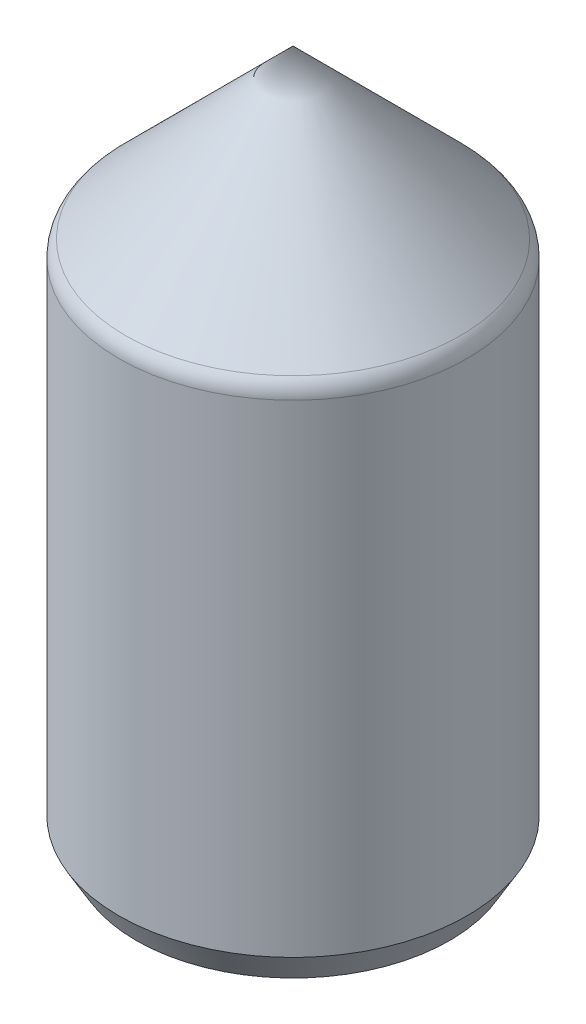
ISO-10303-21;
HEADER;
FILE_DESCRIPTION(('STEP AP214'),'2;1');
FILE_NAME('part.step','',(''),(''),'','','');
FILE_SCHEMA(('AUTOMOTIVE_DESIGN { 1 0 10303 214 1 1 1 1 }'));
ENDSEC;
DATA;
#1=APPLICATION_CONTEXT('core data for automotive mechanical design processes');
#2=APPLICATION_PROTOCOL_DEFINITION('international standard','automotive_design',2000,#1);
#3=PRODUCT_CONTEXT('',#1,'mechanical');
#4=PRODUCT('Part','Part','',(#3));
#5=PRODUCT_RELATED_PRODUCT_CATEGORY('part','',(#4));
#6=PRODUCT_DEFINITION_FORMATION('','',#4);
#7=PRODUCT_DEFINITION_CONTEXT('part definition',#1,'design');
#8=PRODUCT_DEFINITION('design','',#6,#7);
#9=PRODUCT_DEFINITION_SHAPE('','',#8);
#10=(LENGTH_UNIT() NAMED_UNIT(*) SI_UNIT(.MILLI.,.METRE.));
#11=(NAMED_UNIT(*) PLANE_ANGLE_UNIT() SI_UNIT($,.RADIAN.));
#12=(NAMED_UNIT(*) SI_UNIT($,.STERADIAN.) SOLID_ANGLE_UNIT());
#13=UNCERTAINTY_MEASURE_WITH_UNIT(LENGTH_MEASURE(1.E-05),#10,'distance_accuracy_value','');
#14=(GEOMETRIC_REPRESENTATION_CONTEXT(3) GLOBAL_UNCERTAINTY_ASSIGNED_CONTEXT((#13)) GLOBAL_UNIT_ASSIGNED_CONTEXT((#10,
#11,#12)) REPRESENTATION_CONTEXT('',''));
#15=CARTESIAN_POINT('',(0.,0.,0.));
#16=DIRECTION('',(0.,0.,1.));
#17=DIRECTION('',(1.,0.,0.));
#18=AXIS2_PLACEMENT_3D('',#15,#16,#17);
#19=CARTESIAN_POINT('',(0.,0.,0.));
#20=DIRECTION('',(0.,1.,0.));
#21=DIRECTION('',(0.,0.,1.));
#22=AXIS2_PLACEMENT_3D('',#19,#20,#21);
#23=PLANE('',#22);
#24=CARTESIAN_POINT('',(0.,0.,0.));
#25=DIRECTION('',(0.,1.,0.));
#26=DIRECTION('',(0.,0.,1.));
#27=AXIS2_PLACEMENT_3D('',#24,#25,#26);
#28=CIRCLE('',#27,1.35);
#29=CARTESIAN_POINT('',(0.,0.,1.35));
#30=VERTEX_POINT('',#29);
#31=EDGE_CURVE('E11',#30,#30,#28,.F.);
#32=ORIENTED_EDGE('',*,*,#31,.T.);
#33=EDGE_LOOP('',(#32));
#34=FACE_BOUND('',#33,.T.);
#35=DIRECTION('',(-0.866025403784439,0.,0.5));
#36=VECTOR('',#35,1.);
#37=CARTESIAN_POINT('',(0.375,0.,0.649519052838329));
#38=LINE('',#37,#36);
#39=CARTESIAN_POINT('',(0.75,0.,0.43301270189222));
#40=VERTEX_POINT('',#39);
#41=CARTESIAN_POINT('',(0.,0.,0.866025403784439));
#42=VERTEX_POINT('',#41);
#43=EDGE_CURVE('E110',#40,#42,#38,.T.);
#44=ORIENTED_EDGE('',*,*,#43,.F.);
#45=DIRECTION('',(0.,0.,1.));
#46=VECTOR('',#45,1.);
#47=CARTESIAN_POINT('',(0.75,0.,0.));
#48=LINE('',#47,#46);
#49=CARTESIAN_POINT('',(0.75,0.,-0.43301270189222));
#50=VERTEX_POINT('',#49);
#51=EDGE_CURVE('E165',#50,#40,#48,.T.);
#52=ORIENTED_EDGE('',*,*,#51,.F.);
#53=DIRECTION('',(0.866025403784439,0.,0.5));
#54=VECTOR('',#53,1.);
#55=CARTESIAN_POINT('',(0.375,0.,-0.649519052838329));
#56=LINE('',#55,#54);
#57=CARTESIAN_POINT('',(0.,0.,-0.866025403784439));
#58=VERTEX_POINT('',#57);
#59=EDGE_CURVE('E168',#58,#50,#56,.T.);
#60=ORIENTED_EDGE('',*,*,#59,.F.);
#61=DIRECTION('',(0.866025403784439,0.,-0.5));
#62=VECTOR('',#61,1.);
#63=CARTESIAN_POINT('',(-0.375,0.,-0.649519052838329));
#64=LINE('',#63,#62);
#65=CARTESIAN_POINT('',(-0.75,0.,-0.433012701892219));
#66=VERTEX_POINT('',#65);
#67=EDGE_CURVE('E171',#66,#58,#64,.T.);
#68=ORIENTED_EDGE('',*,*,#67,.F.);
#69=DIRECTION('',(0.,0.,-1.));
#70=VECTOR('',#69,1.);
#71=CARTESIAN_POINT('',(-0.75,0.,0.));
#72=LINE('',#71,#70);
#73=CARTESIAN_POINT('',(-0.75,0.,0.43301270189222));
#74=VERTEX_POINT('',#73);
#75=EDGE_CURVE('E174',#74,#66,#72,.T.);
#76=ORIENTED_EDGE('',*,*,#75,.F.);
#77=DIRECTION('',(-0.866025403784439,0.,-0.5));
#78=VECTOR('',#77,1.);
#79=CARTESIAN_POINT('',(-0.375,0.,0.649519052838329));
#80=LINE('',#79,#78);
#81=EDGE_CURVE('E177',#42,#74,#80,.T.);
#82=ORIENTED_EDGE('',*,*,#81,.F.);
#83=EDGE_LOOP('',(#44,#52,#60,#68,#76,#82));
#84=FACE_BOUND('',#83,.T.);
#85=ADVANCED_FACE('F47',(#34,#84),#23,.F.);
#86=CARTESIAN_POINT('',(0.,4.5,0.));
#87=DIRECTION('',(0.,-1.,0.));
#88=DIRECTION('',(0.,0.,-1.));
#89=AXIS2_PLACEMENT_3D('',#86,#87,#88);
#90=CONICAL_SURFACE('',#89,1.5,0.785398163397449);
#91=CARTESIAN_POINT('',(0.,4.55857864376269,0.));
#92=DIRECTION('',(0.,1.,0.));
#93=DIRECTION('',(0.,0.,1.));
#94=AXIS2_PLACEMENT_3D('',#91,#92,#93);
#95=CIRCLE('',#94,1.44142135623731);
#96=CARTESIAN_POINT('',(0.,4.55857864376269,1.44142135623731));
#97=VERTEX_POINT('',#96);
#98=EDGE_CURVE('E114',#97,#97,#95,.T.);
#99=ORIENTED_EDGE('',*,*,#98,.T.);
#100=EDGE_LOOP('',(#99));
#101=FACE_BOUND('',#100,.T.);
#102=CARTESIAN_POINT('',(0.,6.,0.));
#103=VERTEX_POINT('',#102);
#104=VERTEX_LOOP('',#103);
#105=FACE_BOUND('',#104,.T.);
#106=ADVANCED_FACE('F199',(#101,#105),#90,.T.);
#107=CARTESIAN_POINT('',(0.,6.,0.));
#108=DIRECTION('',(0.,1.,0.));
#109=DIRECTION('',(0.,0.,1.));
#110=AXIS2_PLACEMENT_3D('',#107,#108,#109);
#111=CYLINDRICAL_SURFACE('',#110,1.5);
#112=CARTESIAN_POINT('',(0.,0.259807621135331,0.));
#113=DIRECTION('',(0.,1.,0.));
#114=DIRECTION('',(0.,0.,1.));
#115=AXIS2_PLACEMENT_3D('',#112,#113,#114);
#116=CIRCLE('',#115,1.5);
#117=CARTESIAN_POINT('',(0.,0.259807621135331,1.5));
#118=VERTEX_POINT('',#117);
#119=EDGE_CURVE('E57',#118,#118,#116,.T.);
#120=ORIENTED_EDGE('',*,*,#119,.T.);
#121=EDGE_LOOP('',(#120));
#122=FACE_BOUND('',#121,.T.);
#123=CARTESIAN_POINT('',(0.,4.41715728752538,0.));
#124=DIRECTION('',(0.,-1.,0.));
#125=DIRECTION('',(0.,0.,-1.));
#126=AXIS2_PLACEMENT_3D('',#123,#124,#125);
#127=CIRCLE('',#126,1.5);
#128=CARTESIAN_POINT('',(0.,4.41715728752538,-1.5));
#129=VERTEX_POINT('',#128);
#130=EDGE_CURVE('E161',#129,#129,#127,.T.);
#131=ORIENTED_EDGE('',*,*,#130,.T.);
#132=EDGE_LOOP('',(#131));
#133=FACE_BOUND('',#132,.T.);
#134=ADVANCED_FACE('F186',(#122,#133),#111,.T.);
#135=CARTESIAN_POINT('',(0.,4.41715728752538,0.));
#136=DIRECTION('',(0.,-1.,0.));
#137=DIRECTION('',(0.,0.,-1.));
#138=AXIS2_PLACEMENT_3D('',#135,#136,#137);
#139=TOROIDAL_SURFACE('',#138,1.3,0.2);
#140=ORIENTED_EDGE('',*,*,#130,.F.);
#141=EDGE_LOOP('',(#140));
#142=FACE_BOUND('',#141,.T.);
#143=ORIENTED_EDGE('',*,*,#98,.F.);
#144=EDGE_LOOP('',(#143));
#145=FACE_BOUND('',#144,.T.);
#146=ADVANCED_FACE('F209',(#142,#145),#139,.T.);
#147=CARTESIAN_POINT('',(0.75,-1.2E-05,0.43301270189222));
#148=DIRECTION('',(-0.5,0.,-0.866025403784439));
#149=DIRECTION('',(-0.866025403784439,0.,0.5));
#150=AXIS2_PLACEMENT_3D('',#147,#148,#149);
#151=PLANE('',#150);
#152=ORIENTED_EDGE('',*,*,#43,.T.);
#153=DIRECTION('',(0.,1.,0.));
#154=VECTOR('',#153,1.);
#155=CARTESIAN_POINT('',(0.,-1.2E-05,0.866025403784439));
#156=LINE('',#155,#154);
#157=CARTESIAN_POINT('',(0.,2.1,0.866025403784439));
#158=VERTEX_POINT('',#157);
#159=EDGE_CURVE('E102',#42,#158,#156,.T.);
#160=ORIENTED_EDGE('',*,*,#159,.T.);
#161=DIRECTION('',(-0.866025403784438,0.,0.5));
#162=VECTOR('',#161,1.);
#163=CARTESIAN_POINT('',(0.75,2.1,0.43301270189222));
#164=LINE('',#163,#162);
#165=CARTESIAN_POINT('',(0.75,2.1,0.43301270189222));
#166=VERTEX_POINT('',#165);
#167=EDGE_CURVE('E107',#166,#158,#164,.T.);
#168=ORIENTED_EDGE('',*,*,#167,.F.);
#169=DIRECTION('',(0.,1.,0.));
#170=VECTOR('',#169,1.);
#171=CARTESIAN_POINT('',(0.75,-1.2E-05,0.43301270189222));
#172=LINE('',#171,#170);
#173=EDGE_CURVE('E145',#40,#166,#172,.T.);
#174=ORIENTED_EDGE('',*,*,#173,.F.);
#175=EDGE_LOOP('',(#152,#160,#168,#174));
#176=FACE_BOUND('',#175,.T.);
#177=ADVANCED_FACE('F104',(#176),#151,.T.);
#178=CARTESIAN_POINT('',(0.,-1.2E-05,0.866025403784439));
#179=DIRECTION('',(0.5,0.,-0.866025403784439));
#180=DIRECTION('',(-0.866025403784439,0.,-0.5));
#181=AXIS2_PLACEMENT_3D('',#178,#179,#180);
#182=PLANE('',#181);
#183=ORIENTED_EDGE('',*,*,#81,.T.);
#184=DIRECTION('',(0.,1.,0.));
#185=VECTOR('',#184,1.);
#186=CARTESIAN_POINT('',(-0.75,-1.2E-05,0.43301270189222));
#187=LINE('',#186,#185);
#188=CARTESIAN_POINT('',(-0.75,2.1,0.43301270189222));
#189=VERTEX_POINT('',#188);
#190=EDGE_CURVE('E115',#74,#189,#187,.T.);
#191=ORIENTED_EDGE('',*,*,#190,.T.);
#192=DIRECTION('',(-0.866025403784439,0.,-0.5));
#193=VECTOR('',#192,1.);
#194=CARTESIAN_POINT('',(0.,2.1,0.866025403784439));
#195=LINE('',#194,#193);
#196=EDGE_CURVE('E118',#158,#189,#195,.T.);
#197=ORIENTED_EDGE('',*,*,#196,.F.);
#198=ORIENTED_EDGE('',*,*,#159,.F.);
#199=EDGE_LOOP('',(#183,#191,#197,#198));
#200=FACE_BOUND('',#199,.T.);
#201=ADVANCED_FACE('F119',(#200),#182,.T.);
#202=CARTESIAN_POINT('',(-0.75,-1.2E-05,0.43301270189222));
#203=DIRECTION('',(1.,0.,0.));
#204=DIRECTION('',(0.,0.,-1.));
#205=AXIS2_PLACEMENT_3D('',#202,#203,#204);
#206=PLANE('',#205);
#207=ORIENTED_EDGE('',*,*,#75,.T.);
#208=DIRECTION('',(0.,1.,0.));
#209=VECTOR('',#208,1.);
#210=CARTESIAN_POINT('',(-0.75,-1.2E-05,-0.433012701892219));
#211=LINE('',#210,#209);
#212=CARTESIAN_POINT('',(-0.75,2.1,-0.433012701892219));
#213=VERTEX_POINT('',#212);
#214=EDGE_CURVE('E153',#66,#213,#211,.T.);
#215=ORIENTED_EDGE('',*,*,#214,.T.);
#216=DIRECTION('',(0.,0.,-1.));
#217=VECTOR('',#216,1.);
#218=CARTESIAN_POINT('',(-0.75,2.1,0.43301270189222));
#219=LINE('',#218,#217);
#220=EDGE_CURVE('E125',#189,#213,#219,.T.);
#221=ORIENTED_EDGE('',*,*,#220,.F.);
#222=ORIENTED_EDGE('',*,*,#190,.F.);
#223=EDGE_LOOP('',(#207,#215,#221,#222));
#224=FACE_BOUND('',#223,.T.);
#225=ADVANCED_FACE('F224',(#224),#206,.T.);
#226=CARTESIAN_POINT('',(-0.75,-1.2E-05,-0.433012701892219));
#227=DIRECTION('',(0.5,0.,0.866025403784439));
#228=DIRECTION('',(0.866025403784439,0.,-0.5));
#229=AXIS2_PLACEMENT_3D('',#226,#227,#228);
#230=PLANE('',#229);
#231=ORIENTED_EDGE('',*,*,#67,.T.);
#232=DIRECTION('',(0.,1.,0.));
#233=VECTOR('',#232,1.);
#234=CARTESIAN_POINT('',(0.,-1.2E-05,-0.866025403784439));
#235=LINE('',#234,#233);
#236=CARTESIAN_POINT('',(0.,2.1,-0.866025403784439));
#237=VERTEX_POINT('',#236);
#238=EDGE_CURVE('E150',#58,#237,#235,.T.);
#239=ORIENTED_EDGE('',*,*,#238,.T.);
#240=DIRECTION('',(0.866025403784439,0.,-0.5));
#241=VECTOR('',#240,1.);
#242=CARTESIAN_POINT('',(-0.75,2.1,-0.433012701892219));
#243=LINE('',#242,#241);
#244=EDGE_CURVE('E136',#213,#237,#243,.T.);
#245=ORIENTED_EDGE('',*,*,#244,.F.);
#246=ORIENTED_EDGE('',*,*,#214,.F.);
#247=EDGE_LOOP('',(#231,#239,#245,#246));
#248=FACE_BOUND('',#247,.T.);
#249=ADVANCED_FACE('F227',(#248),#230,.T.);
#250=CARTESIAN_POINT('',(0.,-1.2E-05,-0.866025403784439));
#251=DIRECTION('',(-0.5,0.,0.866025403784439));
#252=DIRECTION('',(0.866025403784439,0.,0.5));
#253=AXIS2_PLACEMENT_3D('',#250,#251,#252);
#254=PLANE('',#253);
#255=ORIENTED_EDGE('',*,*,#59,.T.);
#256=DIRECTION('',(0.,1.,0.));
#257=VECTOR('',#256,1.);
#258=CARTESIAN_POINT('',(0.75,-1.2E-05,-0.43301270189222));
#259=LINE('',#258,#257);
#260=CARTESIAN_POINT('',(0.75,2.1,-0.43301270189222));
#261=VERTEX_POINT('',#260);
#262=EDGE_CURVE('E64',#50,#261,#259,.T.);
#263=ORIENTED_EDGE('',*,*,#262,.T.);
#264=DIRECTION('',(0.866025403784439,0.,0.5));
#265=VECTOR('',#264,1.);
#266=CARTESIAN_POINT('',(0.,2.1,-0.866025403784439));
#267=LINE('',#266,#265);
#268=EDGE_CURVE('E140',#237,#261,#267,.T.);
#269=ORIENTED_EDGE('',*,*,#268,.F.);
#270=ORIENTED_EDGE('',*,*,#238,.F.);
#271=EDGE_LOOP('',(#255,#263,#269,#270));
#272=FACE_BOUND('',#271,.T.);
#273=ADVANCED_FACE('F231',(#272),#254,.T.);
#274=CARTESIAN_POINT('',(0.75,-1.2E-05,-0.43301270189222));
#275=DIRECTION('',(-1.,0.,0.));
#276=DIRECTION('',(0.,0.,1.));
#277=AXIS2_PLACEMENT_3D('',#274,#275,#276);
#278=PLANE('',#277);
#279=ORIENTED_EDGE('',*,*,#51,.T.);
#280=ORIENTED_EDGE('',*,*,#173,.T.);
#281=DIRECTION('',(0.,0.,1.));
#282=VECTOR('',#281,1.);
#283=CARTESIAN_POINT('',(0.75,2.1,-0.43301270189222));
#284=LINE('',#283,#282);
#285=EDGE_CURVE('E129',#261,#166,#284,.T.);
#286=ORIENTED_EDGE('',*,*,#285,.F.);
#287=ORIENTED_EDGE('',*,*,#262,.F.);
#288=EDGE_LOOP('',(#279,#280,#286,#287));
#289=FACE_BOUND('',#288,.T.);
#290=ADVANCED_FACE('F195',(#289),#278,.T.);
#291=CARTESIAN_POINT('',(0.,2.1,0.));
#292=DIRECTION('',(0.,-1.,0.));
#293=DIRECTION('',(0.,0.,-1.));
#294=AXIS2_PLACEMENT_3D('',#291,#292,#293);
#295=PLANE('',#294);
#296=ORIENTED_EDGE('',*,*,#167,.T.);
#297=ORIENTED_EDGE('',*,*,#196,.T.);
#298=ORIENTED_EDGE('',*,*,#220,.T.);
#299=ORIENTED_EDGE('',*,*,#244,.T.);
#300=ORIENTED_EDGE('',*,*,#268,.T.);
#301=ORIENTED_EDGE('',*,*,#285,.T.);
#302=EDGE_LOOP('',(#296,#297,#298,#299,#300,#301));
#303=FACE_BOUND('',#302,.T.);
#304=ADVANCED_FACE('F127',(#303),#295,.T.);
#305=CARTESIAN_POINT('',(0.,0.259807621135331,0.));
#306=DIRECTION('',(0.,1.,0.));
#307=DIRECTION('',(0.,0.,1.));
#308=AXIS2_PLACEMENT_3D('',#305,#306,#307);
#309=CONICAL_SURFACE('',#308,1.5,0.523598775598299);
#310=ORIENTED_EDGE('',*,*,#31,.F.);
#311=EDGE_LOOP('',(#310));
#312=FACE_BOUND('',#311,.T.);
#313=ORIENTED_EDGE('',*,*,#119,.F.);
#314=EDGE_LOOP('',(#313));
#315=FACE_BOUND('',#314,.T.);
#316=ADVANCED_FACE('F50',(#312,#315),#309,.T.);
#317=CLOSED_SHELL('',(#85,#106,#134,#146,#177,#201,#225,#249,#273,#290,#304,#316));
#318=MANIFOLD_SOLID_BREP('B2',#317);
#319=ADVANCED_BREP_SHAPE_REPRESENTATION('',(#18,#318),#14);
#320=SHAPE_DEFINITION_REPRESENTATION(#9,#319);
ENDSEC;
END-ISO-10303-21;
